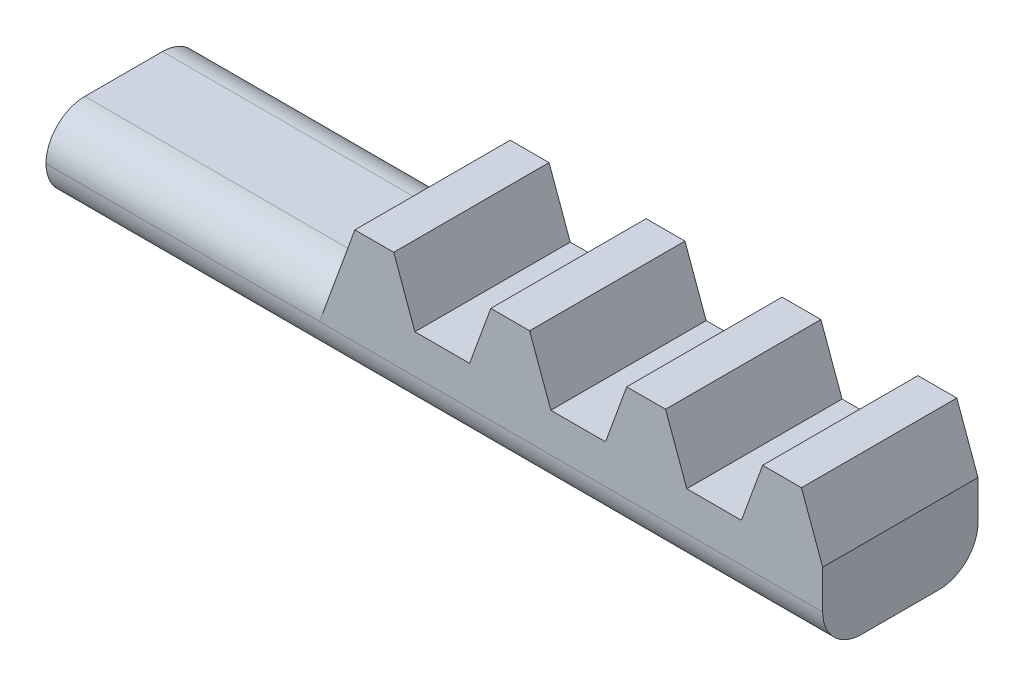
ISO-10303-21;
HEADER;
FILE_DESCRIPTION(('STEP AP214'),'2;1');
FILE_NAME('part.step','',(''),(''),'','','');
FILE_SCHEMA(('AUTOMOTIVE_DESIGN { 1 0 10303 214 1 1 1 1 }'));
ENDSEC;
DATA;
#1=APPLICATION_CONTEXT('core data for automotive mechanical design processes');
#2=APPLICATION_PROTOCOL_DEFINITION('international standard','automotive_design',2000,#1);
#3=PRODUCT_CONTEXT('',#1,'mechanical');
#4=PRODUCT('Part','Part','',(#3));
#5=PRODUCT_RELATED_PRODUCT_CATEGORY('part','',(#4));
#6=PRODUCT_DEFINITION_FORMATION('','',#4);
#7=PRODUCT_DEFINITION_CONTEXT('part definition',#1,'design');
#8=PRODUCT_DEFINITION('design','',#6,#7);
#9=PRODUCT_DEFINITION_SHAPE('','',#8);
#10=(LENGTH_UNIT() NAMED_UNIT(*) SI_UNIT(.MILLI.,.METRE.));
#11=(NAMED_UNIT(*) PLANE_ANGLE_UNIT() SI_UNIT($,.RADIAN.));
#12=(NAMED_UNIT(*) SI_UNIT($,.STERADIAN.) SOLID_ANGLE_UNIT());
#13=UNCERTAINTY_MEASURE_WITH_UNIT(LENGTH_MEASURE(1.E-05),#10,'distance_accuracy_value','');
#14=(GEOMETRIC_REPRESENTATION_CONTEXT(3) GLOBAL_UNCERTAINTY_ASSIGNED_CONTEXT((#13)) GLOBAL_UNIT_ASSIGNED_CONTEXT((#10,
#11,#12)) REPRESENTATION_CONTEXT('',''));
#15=CARTESIAN_POINT('',(0.,0.,0.));
#16=DIRECTION('',(0.,0.,1.));
#17=DIRECTION('',(1.,0.,0.));
#18=AXIS2_PLACEMENT_3D('',#15,#16,#17);
#19=CARTESIAN_POINT('',(0.,0.999999999999862,4.));
#20=DIRECTION('',(0.,1.,0.));
#21=DIRECTION('',(-1.,0.,0.));
#22=AXIS2_PLACEMENT_3D('',#19,#20,#21);
#23=PLANE('',#22);
#24=DIRECTION('',(1.,0.,0.));
#25=VECTOR('',#24,1.);
#26=CARTESIAN_POINT('',(0.,0.999999999999862,0.));
#27=LINE('',#26,#25);
#28=CARTESIAN_POINT('',(6.5,0.999999999999975,0.));
#29=VERTEX_POINT('',#28);
#30=CARTESIAN_POINT('',(7.9080892972014,1.,0.));
#31=VERTEX_POINT('',#30);
#32=EDGE_CURVE('E197',#29,#31,#27,.T.);
#33=ORIENTED_EDGE('',*,*,#32,.F.);
#34=DIRECTION('',(0.,0.,-1.));
#35=VECTOR('',#34,1.);
#36=CARTESIAN_POINT('',(6.5,0.999999999999975,4.));
#37=LINE('',#36,#35);
#38=CARTESIAN_POINT('',(6.5,0.999999999999975,4.));
#39=VERTEX_POINT('',#38);
#40=EDGE_CURVE('E192',#39,#29,#37,.T.);
#41=ORIENTED_EDGE('',*,*,#40,.F.);
#42=DIRECTION('',(1.,0.,0.));
#43=VECTOR('',#42,1.);
#44=CARTESIAN_POINT('',(0.,0.999999999999862,4.));
#45=LINE('',#44,#43);
#46=CARTESIAN_POINT('',(7.9080892972014,1.,4.));
#47=VERTEX_POINT('',#46);
#48=EDGE_CURVE('E195',#39,#47,#45,.T.);
#49=ORIENTED_EDGE('',*,*,#48,.T.);
#50=DIRECTION('',(0.,0.,-1.));
#51=VECTOR('',#50,1.);
#52=CARTESIAN_POINT('',(7.9080892972014,1.,4.));
#53=LINE('',#52,#51);
#54=EDGE_CURVE('E267',#47,#31,#53,.T.);
#55=ORIENTED_EDGE('',*,*,#54,.T.);
#56=EDGE_LOOP('',(#33,#41,#49,#55));
#57=FACE_BOUND('',#56,.T.);
#58=ADVANCED_FACE('F40',(#57),#23,.T.);
#59=CARTESIAN_POINT('',(6.06103824497995,2.20603750992175,4.));
#60=DIRECTION('',(-0.939692620785909,-0.342020143325666,0.));
#61=DIRECTION('',(0.342020143325666,-0.939692620785909,0.));
#62=AXIS2_PLACEMENT_3D('',#59,#60,#61);
#63=PLANE('',#62);
#64=DIRECTION('',(-0.342020143325666,0.939692620785909,0.));
#65=VECTOR('',#64,1.);
#66=CARTESIAN_POINT('',(6.06103824497995,2.20603750992175,0.));
#67=LINE('',#66,#65);
#68=CARTESIAN_POINT('',(5.9540446486007,2.49999999999998,0.));
#69=VERTEX_POINT('',#68);
#70=EDGE_CURVE('E270',#29,#69,#67,.T.);
#71=ORIENTED_EDGE('',*,*,#70,.T.);
#72=DIRECTION('',(0.,0.,-1.));
#73=VECTOR('',#72,1.);
#74=CARTESIAN_POINT('',(5.9540446486007,2.49999999999998,4.));
#75=LINE('',#74,#73);
#76=CARTESIAN_POINT('',(5.9540446486007,2.49999999999998,4.));
#77=VERTEX_POINT('',#76);
#78=EDGE_CURVE('E202',#77,#69,#75,.T.);
#79=ORIENTED_EDGE('',*,*,#78,.F.);
#80=DIRECTION('',(-0.342020143325666,0.939692620785909,0.));
#81=VECTOR('',#80,1.);
#82=CARTESIAN_POINT('',(6.06103824497995,2.20603750992175,4.));
#83=LINE('',#82,#81);
#84=EDGE_CURVE('E205',#39,#77,#83,.T.);
#85=ORIENTED_EDGE('',*,*,#84,.F.);
#86=ORIENTED_EDGE('',*,*,#40,.T.);
#87=EDGE_LOOP('',(#71,#79,#85,#86));
#88=FACE_BOUND('',#87,.T.);
#89=ADVANCED_FACE('F206',(#88),#63,.F.);
#90=CARTESIAN_POINT('',(0.,2.49999999999998,4.));
#91=DIRECTION('',(0.,-1.,0.));
#92=DIRECTION('',(0.,0.,-1.));
#93=AXIS2_PLACEMENT_3D('',#90,#91,#92);
#94=PLANE('',#93);
#95=DIRECTION('',(-1.,0.,0.));
#96=VECTOR('',#95,1.);
#97=CARTESIAN_POINT('',(0.,2.49999999999998,0.));
#98=LINE('',#97,#96);
#99=CARTESIAN_POINT('',(4.9540446486007,2.49999999999998,0.));
#100=VERTEX_POINT('',#99);
#101=EDGE_CURVE('E274',#69,#100,#98,.T.);
#102=ORIENTED_EDGE('',*,*,#101,.T.);
#103=DIRECTION('',(0.,0.,-1.));
#104=VECTOR('',#103,1.);
#105=CARTESIAN_POINT('',(4.9540446486007,2.49999999999998,4.));
#106=LINE('',#105,#104);
#107=CARTESIAN_POINT('',(4.9540446486007,2.49999999999998,4.));
#108=VERTEX_POINT('',#107);
#109=EDGE_CURVE('E373',#108,#100,#106,.T.);
#110=ORIENTED_EDGE('',*,*,#109,.F.);
#111=DIRECTION('',(-1.,0.,0.));
#112=VECTOR('',#111,1.);
#113=CARTESIAN_POINT('',(0.,2.49999999999998,4.));
#114=LINE('',#113,#112);
#115=EDGE_CURVE('E211',#77,#108,#114,.T.);
#116=ORIENTED_EDGE('',*,*,#115,.F.);
#117=ORIENTED_EDGE('',*,*,#78,.T.);
#118=EDGE_LOOP('',(#102,#110,#116,#117));
#119=FACE_BOUND('',#118,.T.);
#120=ADVANCED_FACE('F487',(#119),#94,.F.);
#121=CARTESIAN_POINT('',(3.57104699920414,-1.29975481287594,4.));
#122=DIRECTION('',(0.93969262078591,-0.342020143325665,0.));
#123=DIRECTION('',(0.342020143325665,0.93969262078591,0.));
#124=AXIS2_PLACEMENT_3D('',#121,#122,#123);
#125=PLANE('',#124);
#126=DIRECTION('',(-0.342020143325665,-0.93969262078591,0.));
#127=VECTOR('',#126,1.);
#128=CARTESIAN_POINT('',(3.57104699920414,-1.29975481287594,0.));
#129=LINE('',#128,#127);
#130=CARTESIAN_POINT('',(4.4080892972014,0.999999999999975,0.));
#131=VERTEX_POINT('',#130);
#132=EDGE_CURVE('E277',#100,#131,#129,.T.);
#133=ORIENTED_EDGE('',*,*,#132,.T.);
#134=DIRECTION('',(0.,0.,-1.));
#135=VECTOR('',#134,1.);
#136=CARTESIAN_POINT('',(4.4080892972014,0.999999999999975,4.));
#137=LINE('',#136,#135);
#138=CARTESIAN_POINT('',(4.4080892972014,0.999999999999975,4.));
#139=VERTEX_POINT('',#138);
#140=EDGE_CURVE('E370',#139,#131,#137,.T.);
#141=ORIENTED_EDGE('',*,*,#140,.F.);
#142=DIRECTION('',(-0.342020143325665,-0.93969262078591,0.));
#143=VECTOR('',#142,1.);
#144=CARTESIAN_POINT('',(3.57104699920414,-1.29975481287594,4.));
#145=LINE('',#144,#143);
#146=EDGE_CURVE('E227',#108,#139,#145,.T.);
#147=ORIENTED_EDGE('',*,*,#146,.F.);
#148=ORIENTED_EDGE('',*,*,#109,.T.);
#149=EDGE_LOOP('',(#133,#141,#147,#148));
#150=FACE_BOUND('',#149,.T.);
#151=ADVANCED_FACE('F492',(#150),#125,.F.);
#152=CARTESIAN_POINT('',(0.,0.999999999999899,4.));
#153=DIRECTION('',(0.,1.,0.));
#154=DIRECTION('',(-1.,0.,0.));
#155=AXIS2_PLACEMENT_3D('',#152,#153,#154);
#156=PLANE('',#155);
#157=DIRECTION('',(1.,0.,0.));
#158=VECTOR('',#157,1.);
#159=CARTESIAN_POINT('',(0.,0.999999999999899,0.));
#160=LINE('',#159,#158);
#161=CARTESIAN_POINT('',(3.,0.999999999999951,0.));
#162=VERTEX_POINT('',#161);
#163=EDGE_CURVE('E281',#162,#131,#160,.T.);
#164=ORIENTED_EDGE('',*,*,#163,.F.);
#165=DIRECTION('',(0.,0.,-1.));
#166=VECTOR('',#165,1.);
#167=CARTESIAN_POINT('',(3.,0.999999999999951,4.));
#168=LINE('',#167,#166);
#169=CARTESIAN_POINT('',(3.,0.999999999999951,4.));
#170=VERTEX_POINT('',#169);
#171=EDGE_CURVE('E367',#170,#162,#168,.T.);
#172=ORIENTED_EDGE('',*,*,#171,.F.);
#173=DIRECTION('',(1.,0.,0.));
#174=VECTOR('',#173,1.);
#175=CARTESIAN_POINT('',(0.,0.999999999999899,4.));
#176=LINE('',#175,#174);
#177=EDGE_CURVE('E230',#170,#139,#176,.T.);
#178=ORIENTED_EDGE('',*,*,#177,.T.);
#179=ORIENTED_EDGE('',*,*,#140,.T.);
#180=EDGE_LOOP('',(#164,#172,#178,#179));
#181=FACE_BOUND('',#180,.T.);
#182=ADVANCED_FACE('F496',(#181),#156,.T.);
#183=CARTESIAN_POINT('',(2.97046046952172,1.08115919297031,4.));
#184=DIRECTION('',(-0.939692620785909,-0.342020143325666,0.));
#185=DIRECTION('',(0.342020143325666,-0.939692620785909,0.));
#186=AXIS2_PLACEMENT_3D('',#183,#184,#185);
#187=PLANE('',#186);
#188=DIRECTION('',(-0.342020143325666,0.939692620785909,0.));
#189=VECTOR('',#188,1.);
#190=CARTESIAN_POINT('',(2.97046046952172,1.08115919297031,0.));
#191=LINE('',#190,#189);
#192=CARTESIAN_POINT('',(2.4540446486007,2.49999999999995,0.));
#193=VERTEX_POINT('',#192);
#194=EDGE_CURVE('E285',#162,#193,#191,.T.);
#195=ORIENTED_EDGE('',*,*,#194,.T.);
#196=DIRECTION('',(0.,0.,-1.));
#197=VECTOR('',#196,1.);
#198=CARTESIAN_POINT('',(2.4540446486007,2.49999999999995,4.));
#199=LINE('',#198,#197);
#200=CARTESIAN_POINT('',(2.4540446486007,2.49999999999995,4.));
#201=VERTEX_POINT('',#200);
#202=EDGE_CURVE('E363',#201,#193,#199,.T.);
#203=ORIENTED_EDGE('',*,*,#202,.F.);
#204=DIRECTION('',(-0.342020143325666,0.939692620785909,0.));
#205=VECTOR('',#204,1.);
#206=CARTESIAN_POINT('',(2.97046046952172,1.08115919297031,4.));
#207=LINE('',#206,#205);
#208=EDGE_CURVE('E234',#170,#201,#207,.T.);
#209=ORIENTED_EDGE('',*,*,#208,.F.);
#210=ORIENTED_EDGE('',*,*,#171,.T.);
#211=EDGE_LOOP('',(#195,#203,#209,#210));
#212=FACE_BOUND('',#211,.T.);
#213=ADVANCED_FACE('F500',(#212),#187,.F.);
#214=CARTESIAN_POINT('',(0.,2.49999999999995,4.));
#215=DIRECTION('',(0.,-1.,0.));
#216=DIRECTION('',(0.,0.,-1.));
#217=AXIS2_PLACEMENT_3D('',#214,#215,#216);
#218=PLANE('',#217);
#219=DIRECTION('',(-1.,0.,0.));
#220=VECTOR('',#219,1.);
#221=CARTESIAN_POINT('',(0.,2.49999999999995,0.));
#222=LINE('',#221,#220);
#223=CARTESIAN_POINT('',(1.4540446486007,2.49999999999995,0.));
#224=VERTEX_POINT('',#223);
#225=EDGE_CURVE('E288',#193,#224,#222,.T.);
#226=ORIENTED_EDGE('',*,*,#225,.T.);
#227=DIRECTION('',(0.,0.,-1.));
#228=VECTOR('',#227,1.);
#229=CARTESIAN_POINT('',(1.4540446486007,2.49999999999995,4.));
#230=LINE('',#229,#228);
#231=CARTESIAN_POINT('',(1.4540446486007,2.49999999999995,4.));
#232=VERTEX_POINT('',#231);
#233=EDGE_CURVE('E359',#232,#224,#230,.T.);
#234=ORIENTED_EDGE('',*,*,#233,.F.);
#235=DIRECTION('',(-1.,0.,0.));
#236=VECTOR('',#235,1.);
#237=CARTESIAN_POINT('',(0.,2.49999999999995,4.));
#238=LINE('',#237,#236);
#239=EDGE_CURVE('E237',#201,#232,#238,.T.);
#240=ORIENTED_EDGE('',*,*,#239,.F.);
#241=ORIENTED_EDGE('',*,*,#202,.T.);
#242=EDGE_LOOP('',(#226,#234,#240,#241));
#243=FACE_BOUND('',#242,.T.);
#244=ADVANCED_FACE('F504',(#243),#218,.F.);
#245=CARTESIAN_POINT('',(0.48046922374593,-0.174876495924505,4.));
#246=DIRECTION('',(0.93969262078591,-0.342020143325666,0.));
#247=DIRECTION('',(0.342020143325666,0.93969262078591,0.));
#248=AXIS2_PLACEMENT_3D('',#245,#246,#247);
#249=PLANE('',#248);
#250=DIRECTION('',(-0.342020143325665,-0.93969262078591,0.));
#251=VECTOR('',#250,1.);
#252=CARTESIAN_POINT('',(0.48046922374593,-0.174876495924505,0.));
#253=LINE('',#252,#251);
#254=CARTESIAN_POINT('',(0.908089297201405,0.999999999999951,0.));
#255=VERTEX_POINT('',#254);
#256=EDGE_CURVE('E291',#224,#255,#253,.T.);
#257=ORIENTED_EDGE('',*,*,#256,.T.);
#258=DIRECTION('',(0.,0.,-1.));
#259=VECTOR('',#258,1.);
#260=CARTESIAN_POINT('',(0.908089297201405,0.999999999999951,4.));
#261=LINE('',#260,#259);
#262=CARTESIAN_POINT('',(0.908089297201405,0.999999999999951,4.));
#263=VERTEX_POINT('',#262);
#264=EDGE_CURVE('E356',#263,#255,#261,.T.);
#265=ORIENTED_EDGE('',*,*,#264,.F.);
#266=DIRECTION('',(-0.342020143325665,-0.93969262078591,0.));
#267=VECTOR('',#266,1.);
#268=CARTESIAN_POINT('',(0.48046922374593,-0.174876495924505,4.));
#269=LINE('',#268,#267);
#270=EDGE_CURVE('E240',#232,#263,#269,.T.);
#271=ORIENTED_EDGE('',*,*,#270,.F.);
#272=ORIENTED_EDGE('',*,*,#233,.T.);
#273=EDGE_LOOP('',(#257,#265,#271,#272));
#274=FACE_BOUND('',#273,.T.);
#275=ADVANCED_FACE('F508',(#274),#249,.F.);
#276=CARTESIAN_POINT('',(0.,0.999999999999935,4.));
#277=DIRECTION('',(0.,1.,0.));
#278=DIRECTION('',(-1.,0.,0.));
#279=AXIS2_PLACEMENT_3D('',#276,#277,#278);
#280=PLANE('',#279);
#281=DIRECTION('',(1.,0.,0.));
#282=VECTOR('',#281,1.);
#283=CARTESIAN_POINT('',(0.,0.999999999999935,0.));
#284=LINE('',#283,#282);
#285=CARTESIAN_POINT('',(-0.499999999999999,0.999999999999927,0.));
#286=VERTEX_POINT('',#285);
#287=EDGE_CURVE('E295',#286,#255,#284,.T.);
#288=ORIENTED_EDGE('',*,*,#287,.F.);
#289=DIRECTION('',(0.,0.,-1.));
#290=VECTOR('',#289,1.);
#291=CARTESIAN_POINT('',(-0.499999999999999,0.999999999999927,4.));
#292=LINE('',#291,#290);
#293=CARTESIAN_POINT('',(-0.499999999999999,0.999999999999927,4.));
#294=VERTEX_POINT('',#293);
#295=EDGE_CURVE('E353',#294,#286,#292,.T.);
#296=ORIENTED_EDGE('',*,*,#295,.F.);
#297=DIRECTION('',(1.,0.,0.));
#298=VECTOR('',#297,1.);
#299=CARTESIAN_POINT('',(0.,0.999999999999935,4.));
#300=LINE('',#299,#298);
#301=EDGE_CURVE('E243',#294,#263,#300,.T.);
#302=ORIENTED_EDGE('',*,*,#301,.T.);
#303=ORIENTED_EDGE('',*,*,#264,.T.);
#304=EDGE_LOOP('',(#288,#296,#302,#303));
#305=FACE_BOUND('',#304,.T.);
#306=ADVANCED_FACE('F512',(#305),#280,.T.);
#307=CARTESIAN_POINT('',(-0.1201173059365,-0.0437191239811327,4.));
#308=DIRECTION('',(-0.939692620785909,-0.342020143325666,0.));
#309=DIRECTION('',(0.342020143325666,-0.939692620785909,0.));
#310=AXIS2_PLACEMENT_3D('',#307,#308,#309);
#311=PLANE('',#310);
#312=DIRECTION('',(-0.342020143325666,0.939692620785909,0.));
#313=VECTOR('',#312,1.);
#314=CARTESIAN_POINT('',(-0.1201173059365,-0.0437191239811327,0.));
#315=LINE('',#314,#313);
#316=CARTESIAN_POINT('',(-1.0459553513993,2.49999999999993,0.));
#317=VERTEX_POINT('',#316);
#318=EDGE_CURVE('E299',#286,#317,#315,.T.);
#319=ORIENTED_EDGE('',*,*,#318,.T.);
#320=DIRECTION('',(0.,0.,-1.));
#321=VECTOR('',#320,1.);
#322=CARTESIAN_POINT('',(-1.0459553513993,2.49999999999993,4.));
#323=LINE('',#322,#321);
#324=CARTESIAN_POINT('',(-1.0459553513993,2.49999999999993,4.));
#325=VERTEX_POINT('',#324);
#326=EDGE_CURVE('E349',#325,#317,#323,.T.);
#327=ORIENTED_EDGE('',*,*,#326,.F.);
#328=DIRECTION('',(-0.342020143325666,0.939692620785909,0.));
#329=VECTOR('',#328,1.);
#330=CARTESIAN_POINT('',(-0.1201173059365,-0.0437191239811327,4.));
#331=LINE('',#330,#329);
#332=EDGE_CURVE('E247',#294,#325,#331,.T.);
#333=ORIENTED_EDGE('',*,*,#332,.F.);
#334=ORIENTED_EDGE('',*,*,#295,.T.);
#335=EDGE_LOOP('',(#319,#327,#333,#334));
#336=FACE_BOUND('',#335,.T.);
#337=ADVANCED_FACE('F516',(#336),#311,.F.);
#338=CARTESIAN_POINT('',(0.,2.49999999999993,4.));
#339=DIRECTION('',(0.,-1.,0.));
#340=DIRECTION('',(0.,0.,-1.));
#341=AXIS2_PLACEMENT_3D('',#338,#339,#340);
#342=PLANE('',#341);
#343=DIRECTION('',(-1.,0.,0.));
#344=VECTOR('',#343,1.);
#345=CARTESIAN_POINT('',(0.,2.49999999999993,0.));
#346=LINE('',#345,#344);
#347=CARTESIAN_POINT('',(-2.0459553513993,2.49999999999993,0.));
#348=VERTEX_POINT('',#347);
#349=EDGE_CURVE('E302',#317,#348,#346,.T.);
#350=ORIENTED_EDGE('',*,*,#349,.T.);
#351=DIRECTION('',(0.,0.,-1.));
#352=VECTOR('',#351,1.);
#353=CARTESIAN_POINT('',(-2.0459553513993,2.49999999999993,4.));
#354=LINE('',#353,#352);
#355=CARTESIAN_POINT('',(-2.0459553513993,2.49999999999993,4.));
#356=VERTEX_POINT('',#355);
#357=EDGE_CURVE('E345',#356,#348,#354,.T.);
#358=ORIENTED_EDGE('',*,*,#357,.F.);
#359=DIRECTION('',(-1.,0.,0.));
#360=VECTOR('',#359,1.);
#361=CARTESIAN_POINT('',(0.,2.49999999999993,4.));
#362=LINE('',#361,#360);
#363=EDGE_CURVE('E250',#325,#356,#362,.T.);
#364=ORIENTED_EDGE('',*,*,#363,.F.);
#365=ORIENTED_EDGE('',*,*,#326,.T.);
#366=EDGE_LOOP('',(#350,#358,#364,#365));
#367=FACE_BOUND('',#366,.T.);
#368=ADVANCED_FACE('F452',(#367),#342,.F.);
#369=CARTESIAN_POINT('',(-2.61010855171228,0.950001821026927,4.));
#370=DIRECTION('',(0.93969262078591,-0.342020143325665,0.));
#371=DIRECTION('',(0.342020143325665,0.93969262078591,0.));
#372=AXIS2_PLACEMENT_3D('',#369,#370,#371);
#373=PLANE('',#372);
#374=DIRECTION('',(-0.342020143325665,-0.93969262078591,0.));
#375=VECTOR('',#374,1.);
#376=CARTESIAN_POINT('',(-2.61010855171228,0.950001821026927,0.));
#377=LINE('',#376,#375);
#378=CARTESIAN_POINT('',(-2.95588093706476,0.,0.));
#379=VERTEX_POINT('',#378);
#380=EDGE_CURVE('E305',#348,#379,#377,.T.);
#381=ORIENTED_EDGE('',*,*,#380,.T.);
#382=CARTESIAN_POINT('',(-2.95588093706476,0.,1.));
#383=DIRECTION('',(0.93969262078591,-0.342020143325665,0.));
#384=DIRECTION('',(-0.342020143325665,-0.93969262078591,0.));
#385=AXIS2_PLACEMENT_3D('',#382,#383,#384);
#386=ELLIPSE('',#385,1.06417777247591,1.);
#387=CARTESIAN_POINT('',(-2.59191070279859,0.999999999999927,1.));
#388=VERTEX_POINT('',#387);
#389=EDGE_CURVE('E50',#379,#388,#386,.T.);
#390=ORIENTED_EDGE('',*,*,#389,.T.);
#391=DIRECTION('',(0.,0.,-1.));
#392=VECTOR('',#391,1.);
#393=CARTESIAN_POINT('',(-2.59191070279859,0.999999999999927,4.));
#394=LINE('',#393,#392);
#395=CARTESIAN_POINT('',(-2.59191070279859,0.999999999999927,3.));
#396=VERTEX_POINT('',#395);
#397=EDGE_CURVE('E342',#396,#388,#394,.T.);
#398=ORIENTED_EDGE('',*,*,#397,.F.);
#399=CARTESIAN_POINT('',(-2.95588093706479,0.,3.));
#400=DIRECTION('',(0.93969262078591,-0.342020143325665,0.));
#401=DIRECTION('',(0.342020143325665,0.93969262078591,0.));
#402=AXIS2_PLACEMENT_3D('',#399,#400,#401);
#403=ELLIPSE('',#402,1.06417777247591,1.);
#404=CARTESIAN_POINT('',(-2.95588093706479,0.,4.));
#405=VERTEX_POINT('',#404);
#406=EDGE_CURVE('E11',#396,#405,#403,.T.);
#407=ORIENTED_EDGE('',*,*,#406,.T.);
#408=DIRECTION('',(-0.342020143325665,-0.93969262078591,0.));
#409=VECTOR('',#408,1.);
#410=CARTESIAN_POINT('',(-2.61010855171228,0.950001821026927,4.));
#411=LINE('',#410,#409);
#412=EDGE_CURVE('E253',#356,#405,#411,.T.);
#413=ORIENTED_EDGE('',*,*,#412,.F.);
#414=ORIENTED_EDGE('',*,*,#357,.T.);
#415=EDGE_LOOP('',(#381,#390,#398,#407,#413,#414));
#416=FACE_BOUND('',#415,.T.);
#417=ADVANCED_FACE('F443',(#416),#373,.F.);
#418=CARTESIAN_POINT('',(0.,0.999999999999901,4.));
#419=DIRECTION('',(0.,1.,0.));
#420=DIRECTION('',(-1.,0.,0.));
#421=AXIS2_PLACEMENT_3D('',#418,#419,#420);
#422=PLANE('',#421);
#423=ORIENTED_EDGE('',*,*,#397,.T.);
#424=DIRECTION('',(1.,0.,0.));
#425=VECTOR('',#424,1.);
#426=CARTESIAN_POINT('',(-10.,1.,1.));
#427=LINE('',#426,#425);
#428=CARTESIAN_POINT('',(-10.,1.,1.));
#429=VERTEX_POINT('',#428);
#430=EDGE_CURVE('E413',#388,#429,#427,.F.);
#431=ORIENTED_EDGE('',*,*,#430,.T.);
#432=DIRECTION('',(0.,0.,-1.));
#433=VECTOR('',#432,1.);
#434=CARTESIAN_POINT('',(-10.,1.,4.));
#435=LINE('',#434,#433);
#436=CARTESIAN_POINT('',(-10.,1.,3.));
#437=VERTEX_POINT('',#436);
#438=EDGE_CURVE('E338',#437,#429,#435,.T.);
#439=ORIENTED_EDGE('',*,*,#438,.F.);
#440=DIRECTION('',(1.,0.,0.));
#441=VECTOR('',#440,1.);
#442=CARTESIAN_POINT('',(0.,0.999999999999901,3.));
#443=LINE('',#442,#441);
#444=EDGE_CURVE('E64',#437,#396,#443,.T.);
#445=ORIENTED_EDGE('',*,*,#444,.T.);
#446=EDGE_LOOP('',(#423,#431,#439,#445));
#447=FACE_BOUND('',#446,.T.);
#448=ADVANCED_FACE('F434',(#447),#422,.T.);
#449=CARTESIAN_POINT('',(-10.,0.,4.));
#450=DIRECTION('',(-1.,0.,0.));
#451=DIRECTION('',(0.,0.,1.));
#452=AXIS2_PLACEMENT_3D('',#449,#450,#451);
#453=PLANE('',#452);
#454=CARTESIAN_POINT('',(-10.,0.,1.));
#455=DIRECTION('',(-1.,0.,0.));
#456=DIRECTION('',(0.,0.,1.));
#457=AXIS2_PLACEMENT_3D('',#454,#455,#456);
#458=CIRCLE('',#457,1.);
#459=CARTESIAN_POINT('',(-10.,0.,0.));
#460=VERTEX_POINT('',#459);
#461=EDGE_CURVE('E401',#429,#460,#458,.T.);
#462=ORIENTED_EDGE('',*,*,#461,.T.);
#463=CARTESIAN_POINT('',(-10.,0.,1.));
#464=DIRECTION('',(-1.,0.,0.));
#465=DIRECTION('',(0.,0.,1.));
#466=AXIS2_PLACEMENT_3D('',#463,#464,#465);
#467=CIRCLE('',#466,1.);
#468=CARTESIAN_POINT('',(-10.,-1.,1.));
#469=VERTEX_POINT('',#468);
#470=EDGE_CURVE('E404',#460,#469,#467,.T.);
#471=ORIENTED_EDGE('',*,*,#470,.T.);
#472=DIRECTION('',(0.,0.,-1.));
#473=VECTOR('',#472,1.);
#474=CARTESIAN_POINT('',(-10.,-1.,4.));
#475=LINE('',#474,#473);
#476=CARTESIAN_POINT('',(-10.,-1.,3.));
#477=VERTEX_POINT('',#476);
#478=EDGE_CURVE('E334',#477,#469,#475,.T.);
#479=ORIENTED_EDGE('',*,*,#478,.F.);
#480=CARTESIAN_POINT('',(-10.,0.,3.));
#481=DIRECTION('',(-1.,0.,0.));
#482=DIRECTION('',(0.,0.,1.));
#483=AXIS2_PLACEMENT_3D('',#480,#481,#482);
#484=CIRCLE('',#483,1.);
#485=CARTESIAN_POINT('',(-10.,0.,4.));
#486=VERTEX_POINT('',#485);
#487=EDGE_CURVE('E398',#477,#486,#484,.T.);
#488=ORIENTED_EDGE('',*,*,#487,.T.);
#489=CARTESIAN_POINT('',(-10.,0.,3.));
#490=DIRECTION('',(-1.,0.,0.));
#491=DIRECTION('',(0.,0.,1.));
#492=AXIS2_PLACEMENT_3D('',#489,#490,#491);
#493=CIRCLE('',#492,1.);
#494=EDGE_CURVE('E395',#486,#437,#493,.T.);
#495=ORIENTED_EDGE('',*,*,#494,.T.);
#496=ORIENTED_EDGE('',*,*,#438,.T.);
#497=EDGE_LOOP('',(#462,#471,#479,#488,#495,#496));
#498=FACE_BOUND('',#497,.T.);
#499=ADVANCED_FACE('F436',(#498),#453,.T.);
#500=CARTESIAN_POINT('',(0.,-1.,4.));
#501=DIRECTION('',(0.,1.,0.));
#502=DIRECTION('',(0.,0.,1.));
#503=AXIS2_PLACEMENT_3D('',#500,#501,#502);
#504=PLANE('',#503);
#505=DIRECTION('',(0.,0.,-1.));
#506=VECTOR('',#505,1.);
#507=CARTESIAN_POINT('',(10.,-1.,4.));
#508=LINE('',#507,#506);
#509=CARTESIAN_POINT('',(10.,-1.,3.));
#510=VERTEX_POINT('',#509);
#511=CARTESIAN_POINT('',(10.,-1.,1.));
#512=VERTEX_POINT('',#511);
#513=EDGE_CURVE('E330',#510,#512,#508,.T.);
#514=ORIENTED_EDGE('',*,*,#513,.F.);
#515=DIRECTION('',(1.,0.,0.));
#516=VECTOR('',#515,1.);
#517=CARTESIAN_POINT('',(-10.,-1.,3.));
#518=LINE('',#517,#516);
#519=EDGE_CURVE('E392',#510,#477,#518,.F.);
#520=ORIENTED_EDGE('',*,*,#519,.T.);
#521=ORIENTED_EDGE('',*,*,#478,.T.);
#522=DIRECTION('',(1.,0.,0.));
#523=VECTOR('',#522,1.);
#524=CARTESIAN_POINT('',(0.,-1.,1.));
#525=LINE('',#524,#523);
#526=EDGE_CURVE('E388',#469,#512,#525,.T.);
#527=ORIENTED_EDGE('',*,*,#526,.T.);
#528=EDGE_LOOP('',(#514,#520,#521,#527));
#529=FACE_BOUND('',#528,.T.);
#530=ADVANCED_FACE('F473',(#529),#504,.F.);
#531=CARTESIAN_POINT('',(10.,0.,4.));
#532=DIRECTION('',(-1.,0.,0.));
#533=DIRECTION('',(0.,0.,1.));
#534=AXIS2_PLACEMENT_3D('',#531,#532,#533);
#535=PLANE('',#534);
#536=DIRECTION('',(0.,1.,0.));
#537=VECTOR('',#536,1.);
#538=CARTESIAN_POINT('',(10.,0.,4.));
#539=LINE('',#538,#537);
#540=CARTESIAN_POINT('',(10.,0.,4.));
#541=VERTEX_POINT('',#540);
#542=CARTESIAN_POINT('',(10.,1.,4.));
#543=VERTEX_POINT('',#542);
#544=EDGE_CURVE('E256',#541,#543,#539,.T.);
#545=ORIENTED_EDGE('',*,*,#544,.F.);
#546=CARTESIAN_POINT('',(10.,0.,3.));
#547=DIRECTION('',(-1.,0.,0.));
#548=DIRECTION('',(0.,0.,1.));
#549=AXIS2_PLACEMENT_3D('',#546,#547,#548);
#550=CIRCLE('',#549,1.);
#551=EDGE_CURVE('E385',#541,#510,#550,.F.);
#552=ORIENTED_EDGE('',*,*,#551,.T.);
#553=ORIENTED_EDGE('',*,*,#513,.T.);
#554=CARTESIAN_POINT('',(10.,0.,1.));
#555=DIRECTION('',(-1.,0.,0.));
#556=DIRECTION('',(0.,0.,1.));
#557=AXIS2_PLACEMENT_3D('',#554,#555,#556);
#558=CIRCLE('',#557,1.);
#559=CARTESIAN_POINT('',(10.,0.,0.));
#560=VERTEX_POINT('',#559);
#561=EDGE_CURVE('E382',#512,#560,#558,.F.);
#562=ORIENTED_EDGE('',*,*,#561,.T.);
#563=DIRECTION('',(0.,1.,0.));
#564=VECTOR('',#563,1.);
#565=CARTESIAN_POINT('',(10.,0.,0.));
#566=LINE('',#565,#564);
#567=CARTESIAN_POINT('',(10.,1.,0.));
#568=VERTEX_POINT('',#567);
#569=EDGE_CURVE('E308',#560,#568,#566,.T.);
#570=ORIENTED_EDGE('',*,*,#569,.T.);
#571=DIRECTION('',(0.,0.,-1.));
#572=VECTOR('',#571,1.);
#573=CARTESIAN_POINT('',(10.,1.,4.));
#574=LINE('',#573,#572);
#575=EDGE_CURVE('E326',#543,#568,#574,.T.);
#576=ORIENTED_EDGE('',*,*,#575,.F.);
#577=EDGE_LOOP('',(#545,#552,#553,#562,#570,#576));
#578=FACE_BOUND('',#577,.T.);
#579=ADVANCED_FACE('F463',(#578),#535,.F.);
#580=CARTESIAN_POINT('',(9.15161602043817,3.33091582687319,4.));
#581=DIRECTION('',(-0.939692620785909,-0.342020143325666,0.));
#582=DIRECTION('',(0.342020143325666,-0.939692620785909,0.));
#583=AXIS2_PLACEMENT_3D('',#580,#581,#582);
#584=PLANE('',#583);
#585=DIRECTION('',(-0.342020143325666,0.939692620785909,0.));
#586=VECTOR('',#585,1.);
#587=CARTESIAN_POINT('',(9.15161602043817,3.33091582687319,0.));
#588=LINE('',#587,#586);
#589=CARTESIAN_POINT('',(9.4540446486007,2.5,0.));
#590=VERTEX_POINT('',#589);
#591=EDGE_CURVE('E311',#568,#590,#588,.T.);
#592=ORIENTED_EDGE('',*,*,#591,.T.);
#593=DIRECTION('',(0.,0.,-1.));
#594=VECTOR('',#593,1.);
#595=CARTESIAN_POINT('',(9.4540446486007,2.5,4.));
#596=LINE('',#595,#594);
#597=CARTESIAN_POINT('',(9.4540446486007,2.5,4.));
#598=VERTEX_POINT('',#597);
#599=EDGE_CURVE('E322',#598,#590,#596,.T.);
#600=ORIENTED_EDGE('',*,*,#599,.F.);
#601=DIRECTION('',(-0.342020143325666,0.939692620785909,0.));
#602=VECTOR('',#601,1.);
#603=CARTESIAN_POINT('',(9.15161602043817,3.33091582687319,4.));
#604=LINE('',#603,#602);
#605=EDGE_CURVE('E259',#543,#598,#604,.T.);
#606=ORIENTED_EDGE('',*,*,#605,.F.);
#607=ORIENTED_EDGE('',*,*,#575,.T.);
#608=EDGE_LOOP('',(#592,#600,#606,#607));
#609=FACE_BOUND('',#608,.T.);
#610=ADVANCED_FACE('F466',(#609),#584,.F.);
#611=CARTESIAN_POINT('',(0.,2.5,4.));
#612=DIRECTION('',(0.,-1.,0.));
#613=DIRECTION('',(0.,0.,-1.));
#614=AXIS2_PLACEMENT_3D('',#611,#612,#613);
#615=PLANE('',#614);
#616=DIRECTION('',(-1.,0.,0.));
#617=VECTOR('',#616,1.);
#618=CARTESIAN_POINT('',(0.,2.5,0.));
#619=LINE('',#618,#617);
#620=CARTESIAN_POINT('',(8.4540446486007,2.5,0.));
#621=VERTEX_POINT('',#620);
#622=EDGE_CURVE('E222',#590,#621,#619,.T.);
#623=ORIENTED_EDGE('',*,*,#622,.T.);
#624=DIRECTION('',(0.,0.,-1.));
#625=VECTOR('',#624,1.);
#626=CARTESIAN_POINT('',(8.4540446486007,2.5,4.));
#627=LINE('',#626,#625);
#628=CARTESIAN_POINT('',(8.4540446486007,2.5,4.));
#629=VERTEX_POINT('',#628);
#630=EDGE_CURVE('E318',#629,#621,#627,.T.);
#631=ORIENTED_EDGE('',*,*,#630,.F.);
#632=DIRECTION('',(-1.,0.,0.));
#633=VECTOR('',#632,1.);
#634=CARTESIAN_POINT('',(0.,2.5,4.));
#635=LINE('',#634,#633);
#636=EDGE_CURVE('E262',#598,#629,#635,.T.);
#637=ORIENTED_EDGE('',*,*,#636,.F.);
#638=ORIENTED_EDGE('',*,*,#599,.T.);
#639=EDGE_LOOP('',(#623,#631,#637,#638));
#640=FACE_BOUND('',#639,.T.);
#641=ADVANCED_FACE('F535',(#640),#615,.F.);
#642=CARTESIAN_POINT('',(6.66162477466235,-2.42463312982737,4.));
#643=DIRECTION('',(0.93969262078591,-0.342020143325665,0.));
#644=DIRECTION('',(0.342020143325665,0.93969262078591,0.));
#645=AXIS2_PLACEMENT_3D('',#642,#643,#644);
#646=PLANE('',#645);
#647=DIRECTION('',(-0.342020143325665,-0.93969262078591,0.));
#648=VECTOR('',#647,1.);
#649=CARTESIAN_POINT('',(6.66162477466235,-2.42463312982737,0.));
#650=LINE('',#649,#648);
#651=EDGE_CURVE('E218',#621,#31,#650,.T.);
#652=ORIENTED_EDGE('',*,*,#651,.T.);
#653=ORIENTED_EDGE('',*,*,#54,.F.);
#654=DIRECTION('',(-0.342020143325665,-0.93969262078591,0.));
#655=VECTOR('',#654,1.);
#656=CARTESIAN_POINT('',(6.66162477466235,-2.42463312982737,4.));
#657=LINE('',#656,#655);
#658=EDGE_CURVE('E215',#629,#47,#657,.T.);
#659=ORIENTED_EDGE('',*,*,#658,.F.);
#660=ORIENTED_EDGE('',*,*,#630,.T.);
#661=EDGE_LOOP('',(#652,#653,#659,#660));
#662=FACE_BOUND('',#661,.T.);
#663=ADVANCED_FACE('F538',(#662),#646,.F.);
#664=CARTESIAN_POINT('',(0.,0.,4.));
#665=DIRECTION('',(0.,0.,1.));
#666=DIRECTION('',(1.,0.,0.));
#667=AXIS2_PLACEMENT_3D('',#664,#665,#666);
#668=PLANE('',#667);
#669=ORIENTED_EDGE('',*,*,#412,.T.);
#670=DIRECTION('',(1.,0.,0.));
#671=VECTOR('',#670,1.);
#672=CARTESIAN_POINT('',(10.,0.,4.));
#673=LINE('',#672,#671);
#674=EDGE_CURVE('E201',#405,#541,#673,.T.);
#675=ORIENTED_EDGE('',*,*,#674,.T.);
#676=ORIENTED_EDGE('',*,*,#544,.T.);
#677=ORIENTED_EDGE('',*,*,#605,.T.);
#678=ORIENTED_EDGE('',*,*,#636,.T.);
#679=ORIENTED_EDGE('',*,*,#658,.T.);
#680=ORIENTED_EDGE('',*,*,#48,.F.);
#681=ORIENTED_EDGE('',*,*,#84,.T.);
#682=ORIENTED_EDGE('',*,*,#115,.T.);
#683=ORIENTED_EDGE('',*,*,#146,.T.);
#684=ORIENTED_EDGE('',*,*,#177,.F.);
#685=ORIENTED_EDGE('',*,*,#208,.T.);
#686=ORIENTED_EDGE('',*,*,#239,.T.);
#687=ORIENTED_EDGE('',*,*,#270,.T.);
#688=ORIENTED_EDGE('',*,*,#301,.F.);
#689=ORIENTED_EDGE('',*,*,#332,.T.);
#690=ORIENTED_EDGE('',*,*,#363,.T.);
#691=EDGE_LOOP('',(#669,#675,#676,#677,#678,#679,#680,#681,#682,#683,#684,#685,#686,#687,#688,
#689,#690));
#692=FACE_BOUND('',#691,.T.);
#693=ADVANCED_FACE('F213',(#692),#668,.T.);
#694=CARTESIAN_POINT('',(0.,0.,0.));
#695=DIRECTION('',(0.,0.,1.));
#696=DIRECTION('',(1.,0.,0.));
#697=AXIS2_PLACEMENT_3D('',#694,#695,#696);
#698=PLANE('',#697);
#699=ORIENTED_EDGE('',*,*,#569,.F.);
#700=DIRECTION('',(1.,0.,0.));
#701=VECTOR('',#700,1.);
#702=CARTESIAN_POINT('',(0.,0.,0.));
#703=LINE('',#702,#701);
#704=EDGE_CURVE('E407',#560,#379,#703,.F.);
#705=ORIENTED_EDGE('',*,*,#704,.T.);
#706=ORIENTED_EDGE('',*,*,#380,.F.);
#707=ORIENTED_EDGE('',*,*,#349,.F.);
#708=ORIENTED_EDGE('',*,*,#318,.F.);
#709=ORIENTED_EDGE('',*,*,#287,.T.);
#710=ORIENTED_EDGE('',*,*,#256,.F.);
#711=ORIENTED_EDGE('',*,*,#225,.F.);
#712=ORIENTED_EDGE('',*,*,#194,.F.);
#713=ORIENTED_EDGE('',*,*,#163,.T.);
#714=ORIENTED_EDGE('',*,*,#132,.F.);
#715=ORIENTED_EDGE('',*,*,#101,.F.);
#716=ORIENTED_EDGE('',*,*,#70,.F.);
#717=ORIENTED_EDGE('',*,*,#32,.T.);
#718=ORIENTED_EDGE('',*,*,#651,.F.);
#719=ORIENTED_EDGE('',*,*,#622,.F.);
#720=ORIENTED_EDGE('',*,*,#591,.F.);
#721=EDGE_LOOP('',(#699,#705,#706,#707,#708,#709,#710,#711,#712,#713,#714,#715,#716,#717,#718,
#719,#720));
#722=FACE_BOUND('',#721,.T.);
#723=ADVANCED_FACE('F457',(#722),#698,.F.);
#724=CARTESIAN_POINT('',(0.,0.,3.));
#725=DIRECTION('',(1.,0.,0.));
#726=DIRECTION('',(0.,1.,0.));
#727=AXIS2_PLACEMENT_3D('',#724,#725,#726);
#728=CYLINDRICAL_SURFACE('',#727,1.);
#729=ORIENTED_EDGE('',*,*,#444,.F.);
#730=ORIENTED_EDGE('',*,*,#494,.F.);
#731=DIRECTION('',(1.,0.,0.));
#732=VECTOR('',#731,1.);
#733=CARTESIAN_POINT('',(0.,0.,4.));
#734=LINE('',#733,#732);
#735=EDGE_CURVE('E271',#405,#486,#734,.F.);
#736=ORIENTED_EDGE('',*,*,#735,.F.);
#737=ORIENTED_EDGE('',*,*,#406,.F.);
#738=EDGE_LOOP('',(#729,#730,#736,#737));
#739=FACE_BOUND('',#738,.T.);
#740=ADVANCED_FACE('F440',(#739),#728,.T.);
#741=CARTESIAN_POINT('',(0.,0.,3.));
#742=DIRECTION('',(-1.,0.,0.));
#743=DIRECTION('',(0.,0.,1.));
#744=AXIS2_PLACEMENT_3D('',#741,#742,#743);
#745=CYLINDRICAL_SURFACE('',#744,1.);
#746=ORIENTED_EDGE('',*,*,#487,.F.);
#747=ORIENTED_EDGE('',*,*,#519,.F.);
#748=ORIENTED_EDGE('',*,*,#551,.F.);
#749=ORIENTED_EDGE('',*,*,#674,.F.);
#750=ORIENTED_EDGE('',*,*,#735,.T.);
#751=EDGE_LOOP('',(#746,#747,#748,#749,#750));
#752=FACE_BOUND('',#751,.T.);
#753=ADVANCED_FACE('F474',(#752),#745,.T.);
#754=CARTESIAN_POINT('',(0.,0.,1.));
#755=DIRECTION('',(-1.,0.,0.));
#756=DIRECTION('',(0.,-1.,0.));
#757=AXIS2_PLACEMENT_3D('',#754,#755,#756);
#758=CYLINDRICAL_SURFACE('',#757,1.);
#759=ORIENTED_EDGE('',*,*,#430,.F.);
#760=ORIENTED_EDGE('',*,*,#389,.F.);
#761=DIRECTION('',(1.,0.,0.));
#762=VECTOR('',#761,1.);
#763=CARTESIAN_POINT('',(-2.5919107027986,0.,0.));
#764=LINE('',#763,#762);
#765=EDGE_CURVE('E44',#460,#379,#764,.T.);
#766=ORIENTED_EDGE('',*,*,#765,.F.);
#767=ORIENTED_EDGE('',*,*,#461,.F.);
#768=EDGE_LOOP('',(#759,#760,#766,#767));
#769=FACE_BOUND('',#768,.T.);
#770=ADVANCED_FACE('F42',(#769),#758,.T.);
#771=CARTESIAN_POINT('',(0.,0.,1.));
#772=DIRECTION('',(1.,0.,0.));
#773=DIRECTION('',(0.,0.,-1.));
#774=AXIS2_PLACEMENT_3D('',#771,#772,#773);
#775=CYLINDRICAL_SURFACE('',#774,1.);
#776=ORIENTED_EDGE('',*,*,#765,.T.);
#777=ORIENTED_EDGE('',*,*,#704,.F.);
#778=ORIENTED_EDGE('',*,*,#561,.F.);
#779=ORIENTED_EDGE('',*,*,#526,.F.);
#780=ORIENTED_EDGE('',*,*,#470,.F.);
#781=EDGE_LOOP('',(#776,#777,#778,#779,#780));
#782=FACE_BOUND('',#781,.T.);
#783=ADVANCED_FACE('F429',(#782),#775,.T.);
#784=CLOSED_SHELL('',(#58,#89,#120,#151,#182,#213,#244,#275,#306,#337,#368,#417,#448,#499,#530,
#579,#610,#641,#663,#693,#723,#740,#753,#770,#783));
#785=MANIFOLD_SOLID_BREP('B2',#784);
#786=ADVANCED_BREP_SHAPE_REPRESENTATION('',(#18,#785),#14);
#787=SHAPE_DEFINITION_REPRESENTATION(#9,#786);
ENDSEC;
END-ISO-10303-21;
